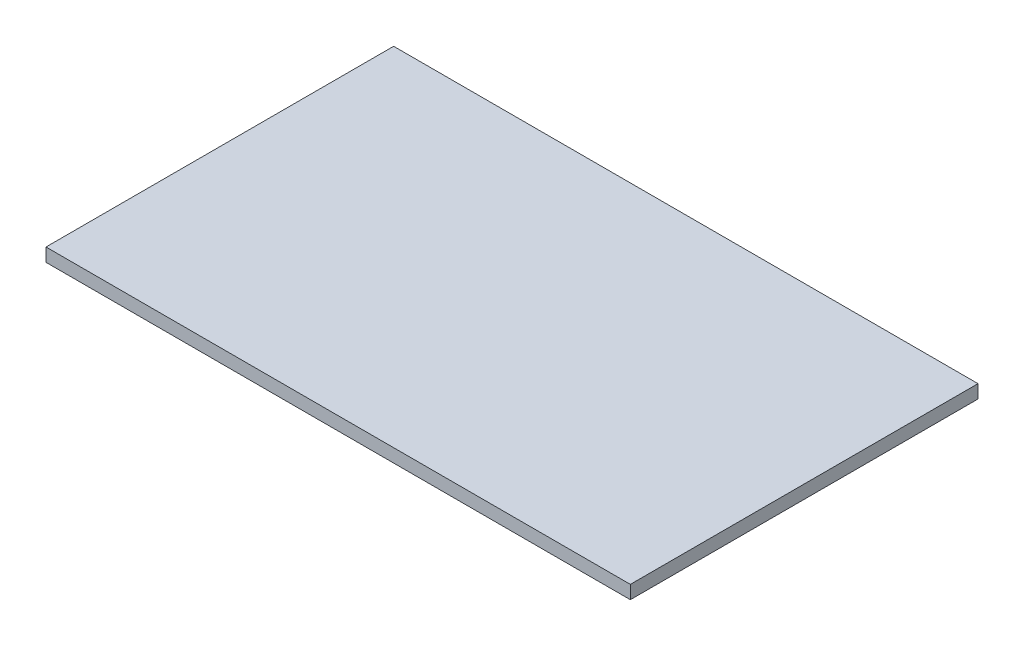
ISO-10303-21;
HEADER;
FILE_DESCRIPTION(('STEP AP214'),'2;1');
FILE_NAME('part.step','',(''),(''),'','','');
FILE_SCHEMA(('AUTOMOTIVE_DESIGN { 1 0 10303 214 1 1 1 1 }'));
ENDSEC;
DATA;
#1=APPLICATION_CONTEXT('core data for automotive mechanical design processes');
#2=APPLICATION_PROTOCOL_DEFINITION('international standard','automotive_design',2000,#1);
#3=PRODUCT_CONTEXT('',#1,'mechanical');
#4=PRODUCT('Part','Part','',(#3));
#5=PRODUCT_RELATED_PRODUCT_CATEGORY('part','',(#4));
#6=PRODUCT_DEFINITION_FORMATION('','',#4);
#7=PRODUCT_DEFINITION_CONTEXT('part definition',#1,'design');
#8=PRODUCT_DEFINITION('design','',#6,#7);
#9=PRODUCT_DEFINITION_SHAPE('','',#8);
#10=(LENGTH_UNIT() NAMED_UNIT(*) SI_UNIT(.MILLI.,.METRE.));
#11=(NAMED_UNIT(*) PLANE_ANGLE_UNIT() SI_UNIT($,.RADIAN.));
#12=(NAMED_UNIT(*) SI_UNIT($,.STERADIAN.) SOLID_ANGLE_UNIT());
#13=UNCERTAINTY_MEASURE_WITH_UNIT(LENGTH_MEASURE(1.E-05),#10,'distance_accuracy_value','');
#14=(GEOMETRIC_REPRESENTATION_CONTEXT(3) GLOBAL_UNCERTAINTY_ASSIGNED_CONTEXT((#13)) GLOBAL_UNIT_ASSIGNED_CONTEXT((#10,
#11,#12)) REPRESENTATION_CONTEXT('',''));
#15=CARTESIAN_POINT('',(0.,0.,0.));
#16=DIRECTION('',(0.,0.,1.));
#17=DIRECTION('',(1.,0.,0.));
#18=AXIS2_PLACEMENT_3D('',#15,#16,#17);
#19=CARTESIAN_POINT('',(395.,18.,235.));
#20=DIRECTION('',(-1.,0.,0.));
#21=DIRECTION('',(0.,0.,1.));
#22=AXIS2_PLACEMENT_3D('',#19,#20,#21);
#23=PLANE('',#22);
#24=DIRECTION('',(0.,0.,-1.));
#25=VECTOR('',#24,1.);
#26=CARTESIAN_POINT('',(395.,0.,235.));
#27=LINE('',#26,#25);
#28=CARTESIAN_POINT('',(395.,0.,235.));
#29=VERTEX_POINT('',#28);
#30=CARTESIAN_POINT('',(395.,0.,-235.));
#31=VERTEX_POINT('',#30);
#32=EDGE_CURVE('E95',#29,#31,#27,.T.);
#33=ORIENTED_EDGE('',*,*,#32,.T.);
#34=DIRECTION('',(0.,-1.,0.));
#35=VECTOR('',#34,1.);
#36=CARTESIAN_POINT('',(395.,18.,-235.));
#37=LINE('',#36,#35);
#38=CARTESIAN_POINT('',(395.,18.,-235.));
#39=VERTEX_POINT('',#38);
#40=EDGE_CURVE('E11',#39,#31,#37,.T.);
#41=ORIENTED_EDGE('',*,*,#40,.F.);
#42=DIRECTION('',(0.,0.,-1.));
#43=VECTOR('',#42,1.);
#44=CARTESIAN_POINT('',(395.,18.,235.));
#45=LINE('',#44,#43);
#46=CARTESIAN_POINT('',(395.,18.,235.));
#47=VERTEX_POINT('',#46);
#48=EDGE_CURVE('E83',#47,#39,#45,.T.);
#49=ORIENTED_EDGE('',*,*,#48,.F.);
#50=DIRECTION('',(0.,-1.,0.));
#51=VECTOR('',#50,1.);
#52=CARTESIAN_POINT('',(395.,18.,235.));
#53=LINE('',#52,#51);
#54=EDGE_CURVE('E91',#47,#29,#53,.T.);
#55=ORIENTED_EDGE('',*,*,#54,.T.);
#56=EDGE_LOOP('',(#33,#41,#49,#55));
#57=FACE_BOUND('',#56,.T.);
#58=ADVANCED_FACE('F32',(#57),#23,.F.);
#59=CARTESIAN_POINT('',(-395.,18.,-235.));
#60=DIRECTION('',(0.,0.,1.));
#61=DIRECTION('',(1.,0.,0.));
#62=AXIS2_PLACEMENT_3D('',#59,#60,#61);
#63=PLANE('',#62);
#64=DIRECTION('',(-1.,0.,0.));
#65=VECTOR('',#64,1.);
#66=CARTESIAN_POINT('',(-395.,0.,-235.));
#67=LINE('',#66,#65);
#68=CARTESIAN_POINT('',(-395.,0.,-235.));
#69=VERTEX_POINT('',#68);
#70=EDGE_CURVE('E87',#31,#69,#67,.T.);
#71=ORIENTED_EDGE('',*,*,#70,.T.);
#72=DIRECTION('',(0.,-1.,0.));
#73=VECTOR('',#72,1.);
#74=CARTESIAN_POINT('',(-395.,18.,-235.));
#75=LINE('',#74,#73);
#76=CARTESIAN_POINT('',(-395.,18.,-235.));
#77=VERTEX_POINT('',#76);
#78=EDGE_CURVE('E40',#77,#69,#75,.T.);
#79=ORIENTED_EDGE('',*,*,#78,.F.);
#80=DIRECTION('',(-1.,0.,0.));
#81=VECTOR('',#80,1.);
#82=CARTESIAN_POINT('',(-395.,18.,-235.));
#83=LINE('',#82,#81);
#84=EDGE_CURVE('E78',#39,#77,#83,.T.);
#85=ORIENTED_EDGE('',*,*,#84,.F.);
#86=ORIENTED_EDGE('',*,*,#40,.T.);
#87=EDGE_LOOP('',(#71,#79,#85,#86));
#88=FACE_BOUND('',#87,.T.);
#89=ADVANCED_FACE('F86',(#88),#63,.F.);
#90=CARTESIAN_POINT('',(-395.,18.,235.));
#91=DIRECTION('',(1.,0.,0.));
#92=DIRECTION('',(0.,0.,-1.));
#93=AXIS2_PLACEMENT_3D('',#90,#91,#92);
#94=PLANE('',#93);
#95=DIRECTION('',(0.,0.,1.));
#96=VECTOR('',#95,1.);
#97=CARTESIAN_POINT('',(-395.,0.,235.));
#98=LINE('',#97,#96);
#99=CARTESIAN_POINT('',(-395.,0.,235.));
#100=VERTEX_POINT('',#99);
#101=EDGE_CURVE('E65',#69,#100,#98,.T.);
#102=ORIENTED_EDGE('',*,*,#101,.T.);
#103=DIRECTION('',(0.,-1.,0.));
#104=VECTOR('',#103,1.);
#105=CARTESIAN_POINT('',(-395.,18.,235.));
#106=LINE('',#105,#104);
#107=CARTESIAN_POINT('',(-395.,18.,235.));
#108=VERTEX_POINT('',#107);
#109=EDGE_CURVE('E88',#108,#100,#106,.T.);
#110=ORIENTED_EDGE('',*,*,#109,.F.);
#111=DIRECTION('',(0.,0.,1.));
#112=VECTOR('',#111,1.);
#113=CARTESIAN_POINT('',(-395.,18.,235.));
#114=LINE('',#113,#112);
#115=EDGE_CURVE('E81',#77,#108,#114,.T.);
#116=ORIENTED_EDGE('',*,*,#115,.F.);
#117=ORIENTED_EDGE('',*,*,#78,.T.);
#118=EDGE_LOOP('',(#102,#110,#116,#117));
#119=FACE_BOUND('',#118,.T.);
#120=ADVANCED_FACE('F89',(#119),#94,.F.);
#121=CARTESIAN_POINT('',(-395.,18.,235.));
#122=DIRECTION('',(0.,0.,-1.));
#123=DIRECTION('',(-1.,0.,0.));
#124=AXIS2_PLACEMENT_3D('',#121,#122,#123);
#125=PLANE('',#124);
#126=DIRECTION('',(1.,0.,0.));
#127=VECTOR('',#126,1.);
#128=CARTESIAN_POINT('',(-395.,0.,235.));
#129=LINE('',#128,#127);
#130=EDGE_CURVE('E71',#100,#29,#129,.T.);
#131=ORIENTED_EDGE('',*,*,#130,.T.);
#132=ORIENTED_EDGE('',*,*,#54,.F.);
#133=DIRECTION('',(1.,0.,0.));
#134=VECTOR('',#133,1.);
#135=CARTESIAN_POINT('',(-395.,18.,235.));
#136=LINE('',#135,#134);
#137=EDGE_CURVE('E48',#108,#47,#136,.T.);
#138=ORIENTED_EDGE('',*,*,#137,.F.);
#139=ORIENTED_EDGE('',*,*,#109,.T.);
#140=EDGE_LOOP('',(#131,#132,#138,#139));
#141=FACE_BOUND('',#140,.T.);
#142=ADVANCED_FACE('F102',(#141),#125,.F.);
#143=CARTESIAN_POINT('',(0.,18.,0.));
#144=DIRECTION('',(0.,-1.,0.));
#145=DIRECTION('',(0.,0.,-1.));
#146=AXIS2_PLACEMENT_3D('',#143,#144,#145);
#147=PLANE('',#146);
#148=ORIENTED_EDGE('',*,*,#48,.T.);
#149=ORIENTED_EDGE('',*,*,#84,.T.);
#150=ORIENTED_EDGE('',*,*,#115,.T.);
#151=ORIENTED_EDGE('',*,*,#137,.T.);
#152=EDGE_LOOP('',(#148,#149,#150,#151));
#153=FACE_BOUND('',#152,.T.);
#154=ADVANCED_FACE('F79',(#153),#147,.F.);
#155=CARTESIAN_POINT('',(0.,0.,0.));
#156=DIRECTION('',(0.,-1.,0.));
#157=DIRECTION('',(0.,0.,-1.));
#158=AXIS2_PLACEMENT_3D('',#155,#156,#157);
#159=PLANE('',#158);
#160=ORIENTED_EDGE('',*,*,#32,.F.);
#161=ORIENTED_EDGE('',*,*,#130,.F.);
#162=ORIENTED_EDGE('',*,*,#101,.F.);
#163=ORIENTED_EDGE('',*,*,#70,.F.);
#164=EDGE_LOOP('',(#160,#161,#162,#163));
#165=FACE_BOUND('',#164,.T.);
#166=ADVANCED_FACE('F105',(#165),#159,.T.);
#167=CLOSED_SHELL('',(#58,#89,#120,#142,#154,#166));
#168=MANIFOLD_SOLID_BREP('B2',#167);
#169=ADVANCED_BREP_SHAPE_REPRESENTATION('',(#18,#168),#14);
#170=SHAPE_DEFINITION_REPRESENTATION(#9,#169);
ENDSEC;
END-ISO-10303-21;
